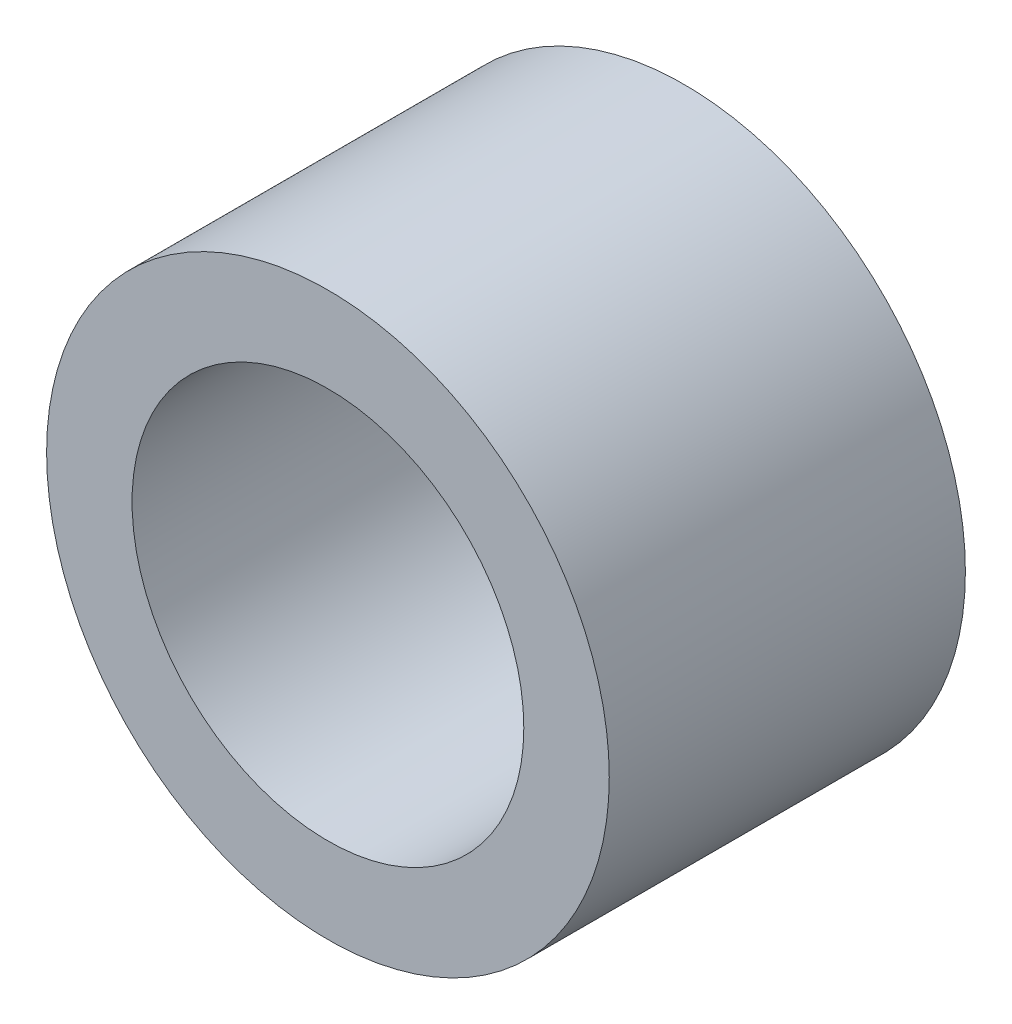
ISO-10303-21;
HEADER;
FILE_DESCRIPTION(('STEP AP214'),'2;1');
FILE_NAME('part.step','',(''),(''),'','','');
FILE_SCHEMA(('AUTOMOTIVE_DESIGN { 1 0 10303 214 1 1 1 1 }'));
ENDSEC;
DATA;
#1=APPLICATION_CONTEXT('core data for automotive mechanical design processes');
#2=APPLICATION_PROTOCOL_DEFINITION('international standard','automotive_design',2000,#1);
#3=PRODUCT_CONTEXT('',#1,'mechanical');
#4=PRODUCT('Part','Part','',(#3));
#5=PRODUCT_RELATED_PRODUCT_CATEGORY('part','',(#4));
#6=PRODUCT_DEFINITION_FORMATION('','',#4);
#7=PRODUCT_DEFINITION_CONTEXT('part definition',#1,'design');
#8=PRODUCT_DEFINITION('design','',#6,#7);
#9=PRODUCT_DEFINITION_SHAPE('','',#8);
#10=(LENGTH_UNIT() NAMED_UNIT(*) SI_UNIT(.MILLI.,.METRE.));
#11=(NAMED_UNIT(*) PLANE_ANGLE_UNIT() SI_UNIT($,.RADIAN.));
#12=(NAMED_UNIT(*) SI_UNIT($,.STERADIAN.) SOLID_ANGLE_UNIT());
#13=UNCERTAINTY_MEASURE_WITH_UNIT(LENGTH_MEASURE(1.E-05),#10,'distance_accuracy_value','');
#14=(GEOMETRIC_REPRESENTATION_CONTEXT(3) GLOBAL_UNCERTAINTY_ASSIGNED_CONTEXT((#13)) GLOBAL_UNIT_ASSIGNED_CONTEXT((#10,
#11,#12)) REPRESENTATION_CONTEXT('',''));
#15=CARTESIAN_POINT('',(0.,0.,0.));
#16=DIRECTION('',(0.,0.,1.));
#17=DIRECTION('',(1.,0.,0.));
#18=AXIS2_PLACEMENT_3D('',#15,#16,#17);
#19=CARTESIAN_POINT('',(0.,0.,5.));
#20=DIRECTION('',(0.,0.,-1.));
#21=DIRECTION('',(-1.,0.,0.));
#22=AXIS2_PLACEMENT_3D('',#19,#20,#21);
#23=CYLINDRICAL_SURFACE('',#22,3.95);
#24=CARTESIAN_POINT('',(0.,0.,5.));
#25=DIRECTION('',(0.,0.,1.));
#26=DIRECTION('',(1.,0.,0.));
#27=AXIS2_PLACEMENT_3D('',#24,#25,#26);
#28=CIRCLE('',#27,3.95);
#29=CARTESIAN_POINT('',(3.95,0.,5.));
#30=VERTEX_POINT('',#29);
#31=EDGE_CURVE('E10',#30,#30,#28,.T.);
#32=ORIENTED_EDGE('',*,*,#31,.F.);
#33=EDGE_LOOP('',(#32));
#34=FACE_BOUND('',#33,.T.);
#35=CARTESIAN_POINT('',(0.,0.,0.));
#36=DIRECTION('',(0.,0.,1.));
#37=DIRECTION('',(1.,0.,0.));
#38=AXIS2_PLACEMENT_3D('',#35,#36,#37);
#39=CIRCLE('',#38,3.95);
#40=CARTESIAN_POINT('',(3.95,0.,0.));
#41=VERTEX_POINT('',#40);
#42=EDGE_CURVE('E35',#41,#41,#39,.T.);
#43=ORIENTED_EDGE('',*,*,#42,.T.);
#44=EDGE_LOOP('',(#43));
#45=FACE_BOUND('',#44,.T.);
#46=ADVANCED_FACE('F32',(#34,#45),#23,.T.);
#47=CARTESIAN_POINT('',(0.,0.,5.));
#48=DIRECTION('',(0.,0.,1.));
#49=DIRECTION('',(1.,0.,0.));
#50=AXIS2_PLACEMENT_3D('',#47,#48,#49);
#51=PLANE('',#50);
#52=CARTESIAN_POINT('',(0.,0.,5.));
#53=DIRECTION('',(0.,0.,1.));
#54=DIRECTION('',(1.,0.,0.));
#55=AXIS2_PLACEMENT_3D('',#52,#53,#54);
#56=CIRCLE('',#55,2.75);
#57=CARTESIAN_POINT('',(2.75,0.,5.));
#58=VERTEX_POINT('',#57);
#59=EDGE_CURVE('E44',#58,#58,#56,.T.);
#60=ORIENTED_EDGE('',*,*,#59,.F.);
#61=EDGE_LOOP('',(#60));
#62=FACE_BOUND('',#61,.T.);
#63=ORIENTED_EDGE('',*,*,#31,.T.);
#64=EDGE_LOOP('',(#63));
#65=FACE_BOUND('',#64,.T.);
#66=ADVANCED_FACE('F59',(#62,#65),#51,.T.);
#67=CARTESIAN_POINT('',(0.,0.,0.));
#68=DIRECTION('',(0.,0.,1.));
#69=DIRECTION('',(1.,0.,0.));
#70=AXIS2_PLACEMENT_3D('',#67,#68,#69);
#71=PLANE('',#70);
#72=CARTESIAN_POINT('',(0.,0.,0.));
#73=DIRECTION('',(0.,0.,1.));
#74=DIRECTION('',(1.,0.,0.));
#75=AXIS2_PLACEMENT_3D('',#72,#73,#74);
#76=CIRCLE('',#75,2.75);
#77=CARTESIAN_POINT('',(2.75,0.,0.));
#78=VERTEX_POINT('',#77);
#79=EDGE_CURVE('E42',#78,#78,#76,.T.);
#80=ORIENTED_EDGE('',*,*,#79,.T.);
#81=EDGE_LOOP('',(#80));
#82=FACE_BOUND('',#81,.T.);
#83=ORIENTED_EDGE('',*,*,#42,.F.);
#84=EDGE_LOOP('',(#83));
#85=FACE_BOUND('',#84,.T.);
#86=ADVANCED_FACE('F50',(#82,#85),#71,.F.);
#87=CARTESIAN_POINT('',(0.,0.,0.));
#88=DIRECTION('',(0.,0.,1.));
#89=DIRECTION('',(1.,0.,0.));
#90=AXIS2_PLACEMENT_3D('',#87,#88,#89);
#91=CYLINDRICAL_SURFACE('',#90,2.75);
#92=ORIENTED_EDGE('',*,*,#79,.F.);
#93=EDGE_LOOP('',(#92));
#94=FACE_BOUND('',#93,.T.);
#95=ORIENTED_EDGE('',*,*,#59,.T.);
#96=EDGE_LOOP('',(#95));
#97=FACE_BOUND('',#96,.T.);
#98=ADVANCED_FACE('F53',(#94,#97),#91,.F.);
#99=CLOSED_SHELL('',(#46,#66,#86,#98));
#100=MANIFOLD_SOLID_BREP('B2',#99);
#101=ADVANCED_BREP_SHAPE_REPRESENTATION('',(#18,#100),#14);
#102=SHAPE_DEFINITION_REPRESENTATION(#9,#101);
ENDSEC;
END-ISO-10303-21;
